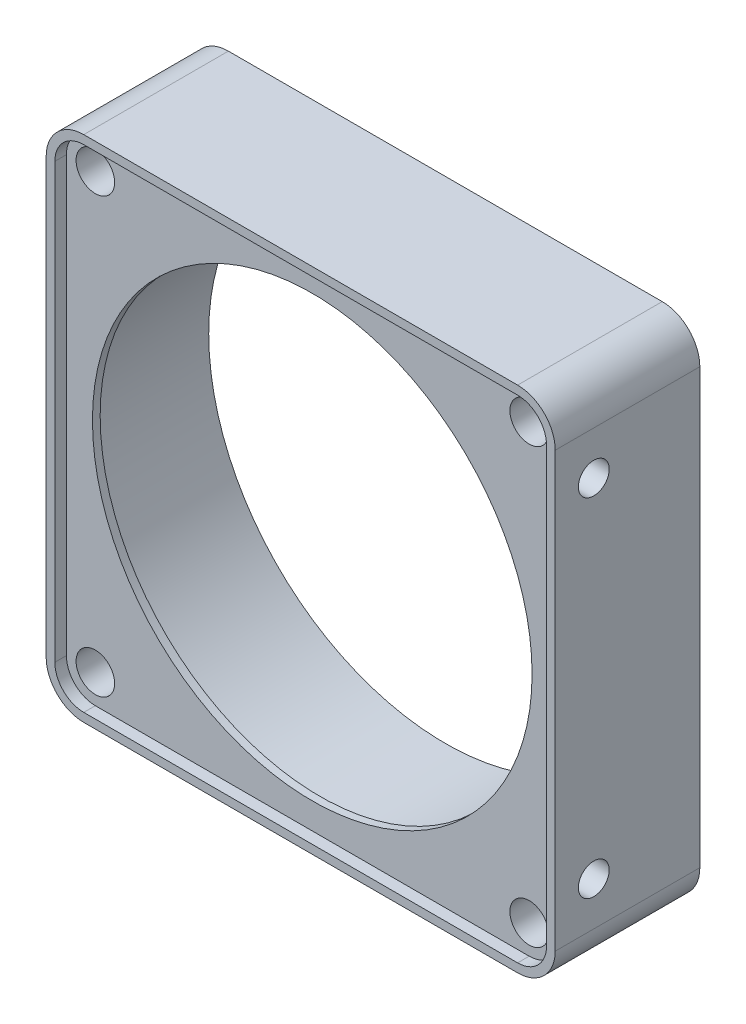
ISO-10303-21;
HEADER;
FILE_DESCRIPTION(('STEP AP214'),'2;1');
FILE_NAME('part.step','',(''),(''),'','','');
FILE_SCHEMA(('AUTOMOTIVE_DESIGN { 1 0 10303 214 1 1 1 1 }'));
ENDSEC;
DATA;
#1=APPLICATION_CONTEXT('core data for automotive mechanical design processes');
#2=APPLICATION_PROTOCOL_DEFINITION('international standard','automotive_design',2000,#1);
#3=PRODUCT_CONTEXT('',#1,'mechanical');
#4=PRODUCT('Part','Part','',(#3));
#5=PRODUCT_RELATED_PRODUCT_CATEGORY('part','',(#4));
#6=PRODUCT_DEFINITION_FORMATION('','',#4);
#7=PRODUCT_DEFINITION_CONTEXT('part definition',#1,'design');
#8=PRODUCT_DEFINITION('design','',#6,#7);
#9=PRODUCT_DEFINITION_SHAPE('','',#8);
#10=(LENGTH_UNIT() NAMED_UNIT(*) SI_UNIT(.MILLI.,.METRE.));
#11=(NAMED_UNIT(*) PLANE_ANGLE_UNIT() SI_UNIT($,.RADIAN.));
#12=(NAMED_UNIT(*) SI_UNIT($,.STERADIAN.) SOLID_ANGLE_UNIT());
#13=UNCERTAINTY_MEASURE_WITH_UNIT(LENGTH_MEASURE(1.E-05),#10,'distance_accuracy_value','');
#14=(GEOMETRIC_REPRESENTATION_CONTEXT(3) GLOBAL_UNCERTAINTY_ASSIGNED_CONTEXT((#13)) GLOBAL_UNIT_ASSIGNED_CONTEXT((#10,
#11,#12)) REPRESENTATION_CONTEXT('',''));
#15=CARTESIAN_POINT('',(0.,0.,0.));
#16=DIRECTION('',(0.,0.,1.));
#17=DIRECTION('',(1.,0.,0.));
#18=AXIS2_PLACEMENT_3D('',#15,#16,#17);
#19=CARTESIAN_POINT('',(-11.25,11.25,-66.75));
#20=DIRECTION('',(0.,0.,1.));
#21=DIRECTION('',(1.,0.,0.));
#22=AXIS2_PLACEMENT_3D('',#19,#20,#21);
#23=CYLINDRICAL_SURFACE('',#22,1.);
#24=CARTESIAN_POINT('',(-11.25,11.25,6.89999999999999));
#25=DIRECTION('',(0.,0.,1.));
#26=DIRECTION('',(1.,0.,0.));
#27=AXIS2_PLACEMENT_3D('',#24,#25,#26);
#28=CIRCLE('',#27,1.);
#29=CARTESIAN_POINT('',(-10.25,11.25,6.89999999999999));
#30=VERTEX_POINT('',#29);
#31=EDGE_CURVE('E19',#30,#30,#28,.F.);
#32=ORIENTED_EDGE('',*,*,#31,.F.);
#33=EDGE_LOOP('',(#32));
#34=FACE_BOUND('',#33,.T.);
#35=CARTESIAN_POINT('',(-11.25,11.25,0.600000000000003));
#36=DIRECTION('',(0.,0.,1.));
#37=DIRECTION('',(1.,0.,0.));
#38=AXIS2_PLACEMENT_3D('',#35,#36,#37);
#39=CIRCLE('',#38,1.);
#40=CARTESIAN_POINT('',(-10.25,11.25,0.600000000000003));
#41=VERTEX_POINT('',#40);
#42=EDGE_CURVE('E292',#41,#41,#39,.T.);
#43=ORIENTED_EDGE('',*,*,#42,.F.);
#44=EDGE_LOOP('',(#43));
#45=FACE_BOUND('',#44,.T.);
#46=ADVANCED_FACE('F16',(#34,#45),#23,.F.);
#47=CARTESIAN_POINT('',(11.25,11.25,-66.75));
#48=DIRECTION('',(0.,0.,1.));
#49=DIRECTION('',(1.,0.,0.));
#50=AXIS2_PLACEMENT_3D('',#47,#48,#49);
#51=CYLINDRICAL_SURFACE('',#50,1.);
#52=CARTESIAN_POINT('',(11.25,11.25,6.89999999999999));
#53=DIRECTION('',(0.,0.,1.));
#54=DIRECTION('',(1.,0.,0.));
#55=AXIS2_PLACEMENT_3D('',#52,#53,#54);
#56=CIRCLE('',#55,1.);
#57=CARTESIAN_POINT('',(12.25,11.25,6.89999999999999));
#58=VERTEX_POINT('',#57);
#59=EDGE_CURVE('E163',#58,#58,#56,.F.);
#60=ORIENTED_EDGE('',*,*,#59,.F.);
#61=EDGE_LOOP('',(#60));
#62=FACE_BOUND('',#61,.T.);
#63=CARTESIAN_POINT('',(11.25,11.25,0.600000000000003));
#64=DIRECTION('',(0.,0.,1.));
#65=DIRECTION('',(1.,0.,0.));
#66=AXIS2_PLACEMENT_3D('',#63,#64,#65);
#67=CIRCLE('',#66,1.);
#68=CARTESIAN_POINT('',(12.25,11.25,0.600000000000003));
#69=VERTEX_POINT('',#68);
#70=EDGE_CURVE('E289',#69,#69,#67,.F.);
#71=ORIENTED_EDGE('',*,*,#70,.T.);
#72=EDGE_LOOP('',(#71));
#73=FACE_BOUND('',#72,.T.);
#74=ADVANCED_FACE('F316',(#62,#73),#51,.F.);
#75=CARTESIAN_POINT('',(-10.2,-9.,5.5));
#76=DIRECTION('',(-1.,0.,0.));
#77=DIRECTION('',(0.,-1.,0.));
#78=AXIS2_PLACEMENT_3D('',#75,#76,#77);
#79=PLANE('',#78);
#80=CARTESIAN_POINT('',(-10.2,-9.,5.5));
#81=DIRECTION('',(-1.,0.,0.));
#82=DIRECTION('',(0.,-1.,0.));
#83=AXIS2_PLACEMENT_3D('',#80,#81,#82);
#84=CIRCLE('',#83,0.8);
#85=CARTESIAN_POINT('',(-10.2,-9.8,5.5));
#86=VERTEX_POINT('',#85);
#87=EDGE_CURVE('E286',#86,#86,#84,.T.);
#88=ORIENTED_EDGE('',*,*,#87,.T.);
#89=EDGE_LOOP('',(#88));
#90=FACE_BOUND('',#89,.T.);
#91=ADVANCED_FACE('F481',(#90),#79,.T.);
#92=CARTESIAN_POINT('',(-10.2,9.,5.5));
#93=DIRECTION('',(-1.,0.,0.));
#94=DIRECTION('',(0.,-1.,0.));
#95=AXIS2_PLACEMENT_3D('',#92,#93,#94);
#96=PLANE('',#95);
#97=CARTESIAN_POINT('',(-10.2,9.,5.5));
#98=DIRECTION('',(-1.,0.,0.));
#99=DIRECTION('',(0.,-1.,0.));
#100=AXIS2_PLACEMENT_3D('',#97,#98,#99);
#101=CIRCLE('',#100,0.8);
#102=CARTESIAN_POINT('',(-10.2,8.2,5.5));
#103=VERTEX_POINT('',#102);
#104=EDGE_CURVE('E283',#103,#103,#101,.T.);
#105=ORIENTED_EDGE('',*,*,#104,.T.);
#106=EDGE_LOOP('',(#105));
#107=FACE_BOUND('',#106,.T.);
#108=ADVANCED_FACE('F477',(#107),#96,.T.);
#109=CARTESIAN_POINT('',(10.2,9.,5.5));
#110=DIRECTION('',(1.,0.,0.));
#111=DIRECTION('',(0.,0.,-1.));
#112=AXIS2_PLACEMENT_3D('',#109,#110,#111);
#113=PLANE('',#112);
#114=CARTESIAN_POINT('',(10.2,9.,5.5));
#115=DIRECTION('',(1.,0.,0.));
#116=DIRECTION('',(0.,0.,-1.));
#117=AXIS2_PLACEMENT_3D('',#114,#115,#116);
#118=CIRCLE('',#117,0.8);
#119=CARTESIAN_POINT('',(10.2,9.,4.7));
#120=VERTEX_POINT('',#119);
#121=EDGE_CURVE('E280',#120,#120,#118,.T.);
#122=ORIENTED_EDGE('',*,*,#121,.T.);
#123=EDGE_LOOP('',(#122));
#124=FACE_BOUND('',#123,.T.);
#125=ADVANCED_FACE('F474',(#124),#113,.T.);
#126=CARTESIAN_POINT('',(-11.25,-12.75,6.89999999999999));
#127=DIRECTION('',(0.,-1.,0.));
#128=DIRECTION('',(1.,0.,0.));
#129=AXIS2_PLACEMENT_3D('',#126,#127,#128);
#130=PLANE('',#129);
#131=DIRECTION('',(0.,0.,1.));
#132=VECTOR('',#131,1.);
#133=CARTESIAN_POINT('',(11.25,-12.75,6.89999999999999));
#134=LINE('',#133,#132);
#135=CARTESIAN_POINT('',(11.25,-12.75,7.49999999999999));
#136=VERTEX_POINT('',#135);
#137=CARTESIAN_POINT('',(11.25,-12.75,6.89999999999999));
#138=VERTEX_POINT('',#137);
#139=EDGE_CURVE('E143',#136,#138,#134,.F.);
#140=ORIENTED_EDGE('',*,*,#139,.T.);
#141=DIRECTION('',(1.,0.,0.));
#142=VECTOR('',#141,1.);
#143=CARTESIAN_POINT('',(11.25,-12.75,6.89999999999999));
#144=LINE('',#143,#142);
#145=CARTESIAN_POINT('',(-11.25,-12.75,6.89999999999999));
#146=VERTEX_POINT('',#145);
#147=EDGE_CURVE('E128',#146,#138,#144,.T.);
#148=ORIENTED_EDGE('',*,*,#147,.F.);
#149=DIRECTION('',(0.,0.,1.));
#150=VECTOR('',#149,1.);
#151=CARTESIAN_POINT('',(-11.25,-12.75,6.89999999999999));
#152=LINE('',#151,#150);
#153=CARTESIAN_POINT('',(-11.25,-12.75,7.49999999999999));
#154=VERTEX_POINT('',#153);
#155=EDGE_CURVE('E179',#146,#154,#152,.T.);
#156=ORIENTED_EDGE('',*,*,#155,.T.);
#157=DIRECTION('',(1.,0.,0.));
#158=VECTOR('',#157,1.);
#159=CARTESIAN_POINT('',(-13.2,-12.75,7.5));
#160=LINE('',#159,#158);
#161=EDGE_CURVE('E279',#136,#154,#160,.F.);
#162=ORIENTED_EDGE('',*,*,#161,.F.);
#163=EDGE_LOOP('',(#140,#148,#156,#162));
#164=FACE_BOUND('',#163,.T.);
#165=ADVANCED_FACE('F448',(#164),#130,.F.);
#166=CARTESIAN_POINT('',(-11.25,-11.25,6.89999999999999));
#167=DIRECTION('',(0.,0.,1.));
#168=DIRECTION('',(1.,0.,0.));
#169=AXIS2_PLACEMENT_3D('',#166,#167,#168);
#170=CYLINDRICAL_SURFACE('',#169,1.5);
#171=ORIENTED_EDGE('',*,*,#155,.F.);
#172=CARTESIAN_POINT('',(-11.25,-11.25,6.89999999999999));
#173=DIRECTION('',(0.,0.,1.));
#174=DIRECTION('',(1.,0.,0.));
#175=AXIS2_PLACEMENT_3D('',#172,#173,#174);
#176=CIRCLE('',#175,1.5);
#177=CARTESIAN_POINT('',(-12.75,-11.25,6.89999999999999));
#178=VERTEX_POINT('',#177);
#179=EDGE_CURVE('E298',#178,#146,#176,.T.);
#180=ORIENTED_EDGE('',*,*,#179,.F.);
#181=DIRECTION('',(0.,0.,1.));
#182=VECTOR('',#181,1.);
#183=CARTESIAN_POINT('',(-12.75,-11.25,6.89999999999999));
#184=LINE('',#183,#182);
#185=CARTESIAN_POINT('',(-12.75,-11.25,7.49999999999999));
#186=VERTEX_POINT('',#185);
#187=EDGE_CURVE('E176',#178,#186,#184,.T.);
#188=ORIENTED_EDGE('',*,*,#187,.T.);
#189=CARTESIAN_POINT('',(-11.25,-11.25,7.49999999999999));
#190=DIRECTION('',(0.,0.,1.));
#191=DIRECTION('',(1.,0.,0.));
#192=AXIS2_PLACEMENT_3D('',#189,#190,#191);
#193=CIRCLE('',#192,1.5);
#194=EDGE_CURVE('E277',#154,#186,#193,.F.);
#195=ORIENTED_EDGE('',*,*,#194,.F.);
#196=EDGE_LOOP('',(#171,#180,#188,#195));
#197=FACE_BOUND('',#196,.T.);
#198=ADVANCED_FACE('F443',(#197),#170,.F.);
#199=CARTESIAN_POINT('',(-12.75,11.25,6.89999999999999));
#200=DIRECTION('',(-1.,0.,0.));
#201=DIRECTION('',(0.,-1.,0.));
#202=AXIS2_PLACEMENT_3D('',#199,#200,#201);
#203=PLANE('',#202);
#204=ORIENTED_EDGE('',*,*,#187,.F.);
#205=DIRECTION('',(0.,1.,0.));
#206=VECTOR('',#205,1.);
#207=CARTESIAN_POINT('',(-12.75,-11.25,6.89999999999999));
#208=LINE('',#207,#206);
#209=CARTESIAN_POINT('',(-12.75,11.25,6.89999999999999));
#210=VERTEX_POINT('',#209);
#211=EDGE_CURVE('E300',#210,#178,#208,.F.);
#212=ORIENTED_EDGE('',*,*,#211,.F.);
#213=DIRECTION('',(0.,0.,1.));
#214=VECTOR('',#213,1.);
#215=CARTESIAN_POINT('',(-12.75,11.25,6.89999999999999));
#216=LINE('',#215,#214);
#217=CARTESIAN_POINT('',(-12.75,11.25,7.49999999999999));
#218=VERTEX_POINT('',#217);
#219=EDGE_CURVE('E173',#210,#218,#216,.T.);
#220=ORIENTED_EDGE('',*,*,#219,.T.);
#221=DIRECTION('',(0.,1.,0.));
#222=VECTOR('',#221,1.);
#223=CARTESIAN_POINT('',(-12.75,-13.2,7.5));
#224=LINE('',#223,#222);
#225=EDGE_CURVE('E276',#186,#218,#224,.T.);
#226=ORIENTED_EDGE('',*,*,#225,.F.);
#227=EDGE_LOOP('',(#204,#212,#220,#226));
#228=FACE_BOUND('',#227,.T.);
#229=ADVANCED_FACE('F461',(#228),#203,.F.);
#230=CARTESIAN_POINT('',(-11.25,11.25,6.89999999999999));
#231=DIRECTION('',(0.,0.,1.));
#232=DIRECTION('',(1.,0.,0.));
#233=AXIS2_PLACEMENT_3D('',#230,#231,#232);
#234=CYLINDRICAL_SURFACE('',#233,1.5);
#235=ORIENTED_EDGE('',*,*,#219,.F.);
#236=CARTESIAN_POINT('',(-11.25,11.25,6.89999999999999));
#237=DIRECTION('',(0.,0.,1.));
#238=DIRECTION('',(1.,0.,0.));
#239=AXIS2_PLACEMENT_3D('',#236,#237,#238);
#240=CIRCLE('',#239,1.5);
#241=CARTESIAN_POINT('',(-11.25,12.75,6.89999999999999));
#242=VERTEX_POINT('',#241);
#243=EDGE_CURVE('E301',#242,#210,#240,.T.);
#244=ORIENTED_EDGE('',*,*,#243,.F.);
#245=DIRECTION('',(0.,0.,1.));
#246=VECTOR('',#245,1.);
#247=CARTESIAN_POINT('',(-11.25,12.75,6.89999999999999));
#248=LINE('',#247,#246);
#249=CARTESIAN_POINT('',(-11.25,12.75,7.49999999999999));
#250=VERTEX_POINT('',#249);
#251=EDGE_CURVE('E170',#242,#250,#248,.T.);
#252=ORIENTED_EDGE('',*,*,#251,.T.);
#253=CARTESIAN_POINT('',(-11.25,11.25,7.49999999999999));
#254=DIRECTION('',(0.,0.,1.));
#255=DIRECTION('',(1.,0.,0.));
#256=AXIS2_PLACEMENT_3D('',#253,#254,#255);
#257=CIRCLE('',#256,1.5);
#258=EDGE_CURVE('E274',#218,#250,#257,.F.);
#259=ORIENTED_EDGE('',*,*,#258,.F.);
#260=EDGE_LOOP('',(#235,#244,#252,#259));
#261=FACE_BOUND('',#260,.T.);
#262=ADVANCED_FACE('F460',(#261),#234,.F.);
#263=CARTESIAN_POINT('',(11.25,12.75,6.89999999999999));
#264=DIRECTION('',(0.,1.,0.));
#265=DIRECTION('',(-1.,0.,0.));
#266=AXIS2_PLACEMENT_3D('',#263,#264,#265);
#267=PLANE('',#266);
#268=ORIENTED_EDGE('',*,*,#251,.F.);
#269=DIRECTION('',(1.,0.,0.));
#270=VECTOR('',#269,1.);
#271=CARTESIAN_POINT('',(11.25,12.75,6.89999999999999));
#272=LINE('',#271,#270);
#273=CARTESIAN_POINT('',(11.25,12.75,6.89999999999999));
#274=VERTEX_POINT('',#273);
#275=EDGE_CURVE('E158',#274,#242,#272,.F.);
#276=ORIENTED_EDGE('',*,*,#275,.F.);
#277=DIRECTION('',(0.,0.,1.));
#278=VECTOR('',#277,1.);
#279=CARTESIAN_POINT('',(11.25,12.75,6.89999999999999));
#280=LINE('',#279,#278);
#281=CARTESIAN_POINT('',(11.25,12.75,7.49999999999999));
#282=VERTEX_POINT('',#281);
#283=EDGE_CURVE('E167',#274,#282,#280,.T.);
#284=ORIENTED_EDGE('',*,*,#283,.T.);
#285=DIRECTION('',(1.,0.,0.));
#286=VECTOR('',#285,1.);
#287=CARTESIAN_POINT('',(-13.2,12.75,7.5));
#288=LINE('',#287,#286);
#289=EDGE_CURVE('E273',#250,#282,#288,.T.);
#290=ORIENTED_EDGE('',*,*,#289,.F.);
#291=EDGE_LOOP('',(#268,#276,#284,#290));
#292=FACE_BOUND('',#291,.T.);
#293=ADVANCED_FACE('F457',(#292),#267,.F.);
#294=CARTESIAN_POINT('',(11.25,11.25,6.89999999999999));
#295=DIRECTION('',(0.,0.,1.));
#296=DIRECTION('',(1.,0.,0.));
#297=AXIS2_PLACEMENT_3D('',#294,#295,#296);
#298=CYLINDRICAL_SURFACE('',#297,1.5);
#299=ORIENTED_EDGE('',*,*,#283,.F.);
#300=CARTESIAN_POINT('',(11.25,11.25,6.89999999999999));
#301=DIRECTION('',(0.,0.,1.));
#302=DIRECTION('',(1.,0.,0.));
#303=AXIS2_PLACEMENT_3D('',#300,#301,#302);
#304=CIRCLE('',#303,1.5);
#305=CARTESIAN_POINT('',(12.75,11.25,6.89999999999999));
#306=VERTEX_POINT('',#305);
#307=EDGE_CURVE('E156',#306,#274,#304,.T.);
#308=ORIENTED_EDGE('',*,*,#307,.F.);
#309=DIRECTION('',(0.,0.,-1.));
#310=VECTOR('',#309,1.);
#311=CARTESIAN_POINT('',(12.75,11.25,6.89999999999999));
#312=LINE('',#311,#310);
#313=CARTESIAN_POINT('',(12.75,11.25,7.49999999999999));
#314=VERTEX_POINT('',#313);
#315=EDGE_CURVE('E155',#306,#314,#312,.F.);
#316=ORIENTED_EDGE('',*,*,#315,.T.);
#317=CARTESIAN_POINT('',(11.25,11.25,7.49999999999999));
#318=DIRECTION('',(0.,0.,1.));
#319=DIRECTION('',(1.,0.,0.));
#320=AXIS2_PLACEMENT_3D('',#317,#318,#319);
#321=CIRCLE('',#320,1.5);
#322=EDGE_CURVE('E271',#282,#314,#321,.F.);
#323=ORIENTED_EDGE('',*,*,#322,.F.);
#324=EDGE_LOOP('',(#299,#308,#316,#323));
#325=FACE_BOUND('',#324,.T.);
#326=ADVANCED_FACE('F454',(#325),#298,.F.);
#327=CARTESIAN_POINT('',(12.75,-11.25,6.89999999999999));
#328=DIRECTION('',(1.,0.,0.));
#329=DIRECTION('',(0.,0.,-1.));
#330=AXIS2_PLACEMENT_3D('',#327,#328,#329);
#331=PLANE('',#330);
#332=ORIENTED_EDGE('',*,*,#315,.F.);
#333=DIRECTION('',(0.,1.,0.));
#334=VECTOR('',#333,1.);
#335=CARTESIAN_POINT('',(12.75,-11.25,6.89999999999999));
#336=LINE('',#335,#334);
#337=CARTESIAN_POINT('',(12.75,-11.25,6.89999999999999));
#338=VERTEX_POINT('',#337);
#339=EDGE_CURVE('E150',#338,#306,#336,.T.);
#340=ORIENTED_EDGE('',*,*,#339,.F.);
#341=DIRECTION('',(0.,0.,1.));
#342=VECTOR('',#341,1.);
#343=CARTESIAN_POINT('',(12.75,-11.25,6.89999999999999));
#344=LINE('',#343,#342);
#345=CARTESIAN_POINT('',(12.75,-11.25,7.49999999999999));
#346=VERTEX_POINT('',#345);
#347=EDGE_CURVE('E135',#338,#346,#344,.T.);
#348=ORIENTED_EDGE('',*,*,#347,.T.);
#349=DIRECTION('',(0.,1.,0.));
#350=VECTOR('',#349,1.);
#351=CARTESIAN_POINT('',(12.75,-13.2,7.5));
#352=LINE('',#351,#350);
#353=EDGE_CURVE('E270',#314,#346,#352,.F.);
#354=ORIENTED_EDGE('',*,*,#353,.F.);
#355=EDGE_LOOP('',(#332,#340,#348,#354));
#356=FACE_BOUND('',#355,.T.);
#357=ADVANCED_FACE('F153',(#356),#331,.F.);
#358=CARTESIAN_POINT('',(11.25,-11.25,6.89999999999999));
#359=DIRECTION('',(0.,0.,1.));
#360=DIRECTION('',(1.,0.,0.));
#361=AXIS2_PLACEMENT_3D('',#358,#359,#360);
#362=CYLINDRICAL_SURFACE('',#361,1.5);
#363=ORIENTED_EDGE('',*,*,#347,.F.);
#364=CARTESIAN_POINT('',(11.25,-11.25,6.89999999999999));
#365=DIRECTION('',(0.,0.,1.));
#366=DIRECTION('',(1.,0.,0.));
#367=AXIS2_PLACEMENT_3D('',#364,#365,#366);
#368=CIRCLE('',#367,1.5);
#369=EDGE_CURVE('E137',#138,#338,#368,.T.);
#370=ORIENTED_EDGE('',*,*,#369,.F.);
#371=ORIENTED_EDGE('',*,*,#139,.F.);
#372=CARTESIAN_POINT('',(11.25,-11.25,7.49999999999999));
#373=DIRECTION('',(0.,0.,1.));
#374=DIRECTION('',(1.,0.,0.));
#375=AXIS2_PLACEMENT_3D('',#372,#373,#374);
#376=CIRCLE('',#375,1.5);
#377=EDGE_CURVE('E139',#346,#136,#376,.F.);
#378=ORIENTED_EDGE('',*,*,#377,.F.);
#379=EDGE_LOOP('',(#363,#370,#371,#378));
#380=FACE_BOUND('',#379,.T.);
#381=ADVANCED_FACE('F136',(#380),#362,.F.);
#382=CARTESIAN_POINT('',(10.2,-9.00000000000001,5.5));
#383=DIRECTION('',(1.,0.,0.));
#384=DIRECTION('',(0.,0.,-1.));
#385=AXIS2_PLACEMENT_3D('',#382,#383,#384);
#386=PLANE('',#385);
#387=CARTESIAN_POINT('',(10.2,-9.00000000000001,5.5));
#388=DIRECTION('',(1.,0.,0.));
#389=DIRECTION('',(0.,0.,-1.));
#390=AXIS2_PLACEMENT_3D('',#387,#388,#389);
#391=CIRCLE('',#390,0.8);
#392=CARTESIAN_POINT('',(10.2,-9.00000000000001,4.7));
#393=VERTEX_POINT('',#392);
#394=EDGE_CURVE('E266',#393,#393,#391,.T.);
#395=ORIENTED_EDGE('',*,*,#394,.T.);
#396=EDGE_LOOP('',(#395));
#397=FACE_BOUND('',#396,.T.);
#398=ADVANCED_FACE('F515',(#397),#386,.T.);
#399=CARTESIAN_POINT('',(-11.25,-11.25,-66.75));
#400=DIRECTION('',(0.,0.,1.));
#401=DIRECTION('',(1.,0.,0.));
#402=AXIS2_PLACEMENT_3D('',#399,#400,#401);
#403=CYLINDRICAL_SURFACE('',#402,1.);
#404=CARTESIAN_POINT('',(-11.25,-11.25,6.89999999999999));
#405=DIRECTION('',(0.,0.,1.));
#406=DIRECTION('',(1.,0.,0.));
#407=AXIS2_PLACEMENT_3D('',#404,#405,#406);
#408=CIRCLE('',#407,1.);
#409=CARTESIAN_POINT('',(-10.25,-11.25,6.89999999999999));
#410=VERTEX_POINT('',#409);
#411=EDGE_CURVE('E305',#410,#410,#408,.F.);
#412=ORIENTED_EDGE('',*,*,#411,.F.);
#413=EDGE_LOOP('',(#412));
#414=FACE_BOUND('',#413,.T.);
#415=CARTESIAN_POINT('',(-11.25,-11.25,0.600000000000003));
#416=DIRECTION('',(0.,0.,1.));
#417=DIRECTION('',(1.,0.,0.));
#418=AXIS2_PLACEMENT_3D('',#415,#416,#417);
#419=CIRCLE('',#418,1.);
#420=CARTESIAN_POINT('',(-10.25,-11.25,0.600000000000003));
#421=VERTEX_POINT('',#420);
#422=EDGE_CURVE('E263',#421,#421,#419,.F.);
#423=ORIENTED_EDGE('',*,*,#422,.T.);
#424=EDGE_LOOP('',(#423));
#425=FACE_BOUND('',#424,.T.);
#426=ADVANCED_FACE('F511',(#414,#425),#403,.F.);
#427=CARTESIAN_POINT('',(11.25,-11.25,-66.75));
#428=DIRECTION('',(0.,0.,1.));
#429=DIRECTION('',(1.,0.,0.));
#430=AXIS2_PLACEMENT_3D('',#427,#428,#429);
#431=CYLINDRICAL_SURFACE('',#430,1.);
#432=CARTESIAN_POINT('',(11.25,-11.25,6.89999999999999));
#433=DIRECTION('',(0.,0.,1.));
#434=DIRECTION('',(1.,0.,0.));
#435=AXIS2_PLACEMENT_3D('',#432,#433,#434);
#436=CIRCLE('',#435,1.);
#437=CARTESIAN_POINT('',(12.25,-11.25,6.89999999999999));
#438=VERTEX_POINT('',#437);
#439=EDGE_CURVE('E295',#438,#438,#436,.F.);
#440=ORIENTED_EDGE('',*,*,#439,.F.);
#441=EDGE_LOOP('',(#440));
#442=FACE_BOUND('',#441,.T.);
#443=CARTESIAN_POINT('',(11.25,-11.25,0.600000000000003));
#444=DIRECTION('',(0.,0.,1.));
#445=DIRECTION('',(1.,0.,0.));
#446=AXIS2_PLACEMENT_3D('',#443,#444,#445);
#447=CIRCLE('',#446,1.);
#448=CARTESIAN_POINT('',(12.25,-11.25,0.600000000000003));
#449=VERTEX_POINT('',#448);
#450=EDGE_CURVE('E260',#449,#449,#447,.T.);
#451=ORIENTED_EDGE('',*,*,#450,.F.);
#452=EDGE_LOOP('',(#451));
#453=FACE_BOUND('',#452,.T.);
#454=ADVANCED_FACE('F507',(#442,#453),#431,.F.);
#455=CARTESIAN_POINT('',(11.25,-11.25,6.89999999999999));
#456=DIRECTION('',(0.,0.,1.));
#457=DIRECTION('',(1.,0.,0.));
#458=AXIS2_PLACEMENT_3D('',#455,#456,#457);
#459=PLANE('',#458);
#460=ORIENTED_EDGE('',*,*,#439,.T.);
#461=EDGE_LOOP('',(#460));
#462=FACE_BOUND('',#461,.T.);
#463=ORIENTED_EDGE('',*,*,#211,.T.);
#464=ORIENTED_EDGE('',*,*,#179,.T.);
#465=ORIENTED_EDGE('',*,*,#147,.T.);
#466=ORIENTED_EDGE('',*,*,#369,.T.);
#467=ORIENTED_EDGE('',*,*,#339,.T.);
#468=ORIENTED_EDGE('',*,*,#307,.T.);
#469=ORIENTED_EDGE('',*,*,#275,.T.);
#470=ORIENTED_EDGE('',*,*,#243,.T.);
#471=EDGE_LOOP('',(#463,#464,#465,#466,#467,#468,#469,#470));
#472=FACE_BOUND('',#471,.T.);
#473=ORIENTED_EDGE('',*,*,#59,.T.);
#474=EDGE_LOOP('',(#473));
#475=FACE_BOUND('',#474,.T.);
#476=ORIENTED_EDGE('',*,*,#411,.T.);
#477=EDGE_LOOP('',(#476));
#478=FACE_BOUND('',#477,.T.);
#479=ORIENTED_EDGE('',*,*,#31,.T.);
#480=EDGE_LOOP('',(#479));
#481=FACE_BOUND('',#480,.T.);
#482=CARTESIAN_POINT('',(0.,0.,6.89999999999999));
#483=DIRECTION('',(0.,0.,-1.));
#484=DIRECTION('',(-1.,0.,0.));
#485=AXIS2_PLACEMENT_3D('',#482,#483,#484);
#486=CIRCLE('',#485,11.4);
#487=CARTESIAN_POINT('',(-11.4,0.,6.89999999999999));
#488=VERTEX_POINT('',#487);
#489=EDGE_CURVE('E257',#488,#488,#486,.T.);
#490=ORIENTED_EDGE('',*,*,#489,.T.);
#491=EDGE_LOOP('',(#490));
#492=FACE_BOUND('',#491,.T.);
#493=ADVANCED_FACE('F147',(#462,#472,#475,#478,#481,#492),#459,.T.);
#494=CARTESIAN_POINT('',(-11.25,11.25,0.6));
#495=DIRECTION('',(0.,0.,-1.));
#496=DIRECTION('',(-1.,0.,0.));
#497=AXIS2_PLACEMENT_3D('',#494,#495,#496);
#498=PLANE('',#497);
#499=ORIENTED_EDGE('',*,*,#42,.T.);
#500=EDGE_LOOP('',(#499));
#501=FACE_BOUND('',#500,.T.);
#502=CARTESIAN_POINT('',(-11.25,11.25,0.6));
#503=DIRECTION('',(0.,0.,-1.));
#504=DIRECTION('',(-1.,0.,0.));
#505=AXIS2_PLACEMENT_3D('',#502,#503,#504);
#506=CIRCLE('',#505,1.6);
#507=CARTESIAN_POINT('',(-12.85,11.25,0.6));
#508=VERTEX_POINT('',#507);
#509=EDGE_CURVE('E254',#508,#508,#506,.T.);
#510=ORIENTED_EDGE('',*,*,#509,.T.);
#511=EDGE_LOOP('',(#510));
#512=FACE_BOUND('',#511,.T.);
#513=ADVANCED_FACE('F319',(#501,#512),#498,.T.);
#514=CARTESIAN_POINT('',(11.25,11.25,0.6));
#515=DIRECTION('',(0.,0.,1.));
#516=DIRECTION('',(1.,0.,0.));
#517=AXIS2_PLACEMENT_3D('',#514,#515,#516);
#518=PLANE('',#517);
#519=CARTESIAN_POINT('',(11.25,11.25,0.6));
#520=DIRECTION('',(0.,0.,-1.));
#521=DIRECTION('',(-1.,0.,0.));
#522=AXIS2_PLACEMENT_3D('',#519,#520,#521);
#523=CIRCLE('',#522,1.6);
#524=CARTESIAN_POINT('',(9.65,11.25,0.6));
#525=VERTEX_POINT('',#524);
#526=EDGE_CURVE('E251',#525,#525,#523,.T.);
#527=ORIENTED_EDGE('',*,*,#526,.T.);
#528=EDGE_LOOP('',(#527));
#529=FACE_BOUND('',#528,.T.);
#530=ORIENTED_EDGE('',*,*,#70,.F.);
#531=EDGE_LOOP('',(#530));
#532=FACE_BOUND('',#531,.T.);
#533=ADVANCED_FACE('F322',(#529,#532),#518,.F.);
#534=CARTESIAN_POINT('',(-10.2,-9.,5.5));
#535=DIRECTION('',(-1.,0.,0.));
#536=DIRECTION('',(0.,-1.,0.));
#537=AXIS2_PLACEMENT_3D('',#534,#535,#536);
#538=CYLINDRICAL_SURFACE('',#537,0.8);
#539=CARTESIAN_POINT('',(-13.2,-9.,5.5));
#540=DIRECTION('',(-1.,0.,0.));
#541=DIRECTION('',(0.,-1.,0.));
#542=AXIS2_PLACEMENT_3D('',#539,#540,#541);
#543=CIRCLE('',#542,0.8);
#544=CARTESIAN_POINT('',(-13.2,-9.8,5.5));
#545=VERTEX_POINT('',#544);
#546=EDGE_CURVE('E240',#545,#545,#543,.T.);
#547=ORIENTED_EDGE('',*,*,#546,.T.);
#548=EDGE_LOOP('',(#547));
#549=FACE_BOUND('',#548,.T.);
#550=ORIENTED_EDGE('',*,*,#87,.F.);
#551=EDGE_LOOP('',(#550));
#552=FACE_BOUND('',#551,.T.);
#553=ADVANCED_FACE('F494',(#549,#552),#538,.F.);
#554=CARTESIAN_POINT('',(-10.2,9.,5.5));
#555=DIRECTION('',(-1.,0.,0.));
#556=DIRECTION('',(0.,-1.,0.));
#557=AXIS2_PLACEMENT_3D('',#554,#555,#556);
#558=CYLINDRICAL_SURFACE('',#557,0.8);
#559=CARTESIAN_POINT('',(-13.2,9.,5.5));
#560=DIRECTION('',(-1.,0.,0.));
#561=DIRECTION('',(0.,-1.,0.));
#562=AXIS2_PLACEMENT_3D('',#559,#560,#561);
#563=CIRCLE('',#562,0.8);
#564=CARTESIAN_POINT('',(-13.2,8.2,5.5));
#565=VERTEX_POINT('',#564);
#566=EDGE_CURVE('E236',#565,#565,#563,.T.);
#567=ORIENTED_EDGE('',*,*,#566,.T.);
#568=EDGE_LOOP('',(#567));
#569=FACE_BOUND('',#568,.T.);
#570=ORIENTED_EDGE('',*,*,#104,.F.);
#571=EDGE_LOOP('',(#570));
#572=FACE_BOUND('',#571,.T.);
#573=ADVANCED_FACE('F500',(#569,#572),#558,.F.);
#574=CARTESIAN_POINT('',(10.2,9.,5.5));
#575=DIRECTION('',(1.,0.,0.));
#576=DIRECTION('',(0.,0.,-1.));
#577=AXIS2_PLACEMENT_3D('',#574,#575,#576);
#578=CYLINDRICAL_SURFACE('',#577,0.8);
#579=CARTESIAN_POINT('',(13.2,9.,5.5));
#580=DIRECTION('',(1.,0.,0.));
#581=DIRECTION('',(0.,0.,-1.));
#582=AXIS2_PLACEMENT_3D('',#579,#580,#581);
#583=CIRCLE('',#582,0.8);
#584=CARTESIAN_POINT('',(13.2,9.,4.7));
#585=VERTEX_POINT('',#584);
#586=EDGE_CURVE('E225',#585,#585,#583,.T.);
#587=ORIENTED_EDGE('',*,*,#586,.T.);
#588=EDGE_LOOP('',(#587));
#589=FACE_BOUND('',#588,.T.);
#590=ORIENTED_EDGE('',*,*,#121,.F.);
#591=EDGE_LOOP('',(#590));
#592=FACE_BOUND('',#591,.T.);
#593=ADVANCED_FACE('F580',(#589,#592),#578,.F.);
#594=CARTESIAN_POINT('',(-13.2,-13.2,7.5));
#595=DIRECTION('',(0.,0.,1.));
#596=DIRECTION('',(1.,0.,0.));
#597=AXIS2_PLACEMENT_3D('',#594,#595,#596);
#598=PLANE('',#597);
#599=DIRECTION('',(0.,1.,0.));
#600=VECTOR('',#599,1.);
#601=CARTESIAN_POINT('',(-13.2,13.2,7.5));
#602=LINE('',#601,#600);
#603=CARTESIAN_POINT('',(-13.2,11.25,7.5));
#604=VERTEX_POINT('',#603);
#605=CARTESIAN_POINT('',(-13.2,-11.25,7.5));
#606=VERTEX_POINT('',#605);
#607=EDGE_CURVE('E239',#604,#606,#602,.F.);
#608=ORIENTED_EDGE('',*,*,#607,.T.);
#609=CARTESIAN_POINT('',(-11.25,-11.25,7.5));
#610=DIRECTION('',(0.,0.,-1.));
#611=DIRECTION('',(-1.,0.,0.));
#612=AXIS2_PLACEMENT_3D('',#609,#610,#611);
#613=CIRCLE('',#612,1.95);
#614=CARTESIAN_POINT('',(-11.25,-13.2,7.5));
#615=VERTEX_POINT('',#614);
#616=EDGE_CURVE('E233',#615,#606,#613,.T.);
#617=ORIENTED_EDGE('',*,*,#616,.F.);
#618=DIRECTION('',(-1.,0.,0.));
#619=VECTOR('',#618,1.);
#620=CARTESIAN_POINT('',(-13.2,-13.2,7.5));
#621=LINE('',#620,#619);
#622=CARTESIAN_POINT('',(11.25,-13.2,7.5));
#623=VERTEX_POINT('',#622);
#624=EDGE_CURVE('E232',#615,#623,#621,.F.);
#625=ORIENTED_EDGE('',*,*,#624,.T.);
#626=CARTESIAN_POINT('',(11.25,-11.25,7.5));
#627=DIRECTION('',(0.,0.,-1.));
#628=DIRECTION('',(-1.,0.,0.));
#629=AXIS2_PLACEMENT_3D('',#626,#627,#628);
#630=CIRCLE('',#629,1.95);
#631=CARTESIAN_POINT('',(13.2,-11.25,7.5));
#632=VERTEX_POINT('',#631);
#633=EDGE_CURVE('E230',#632,#623,#630,.T.);
#634=ORIENTED_EDGE('',*,*,#633,.F.);
#635=DIRECTION('',(0.,1.,0.));
#636=VECTOR('',#635,1.);
#637=CARTESIAN_POINT('',(13.2,-13.2,7.5));
#638=LINE('',#637,#636);
#639=CARTESIAN_POINT('',(13.2,11.25,7.5));
#640=VERTEX_POINT('',#639);
#641=EDGE_CURVE('E224',#632,#640,#638,.T.);
#642=ORIENTED_EDGE('',*,*,#641,.T.);
#643=CARTESIAN_POINT('',(11.25,11.25,7.5));
#644=DIRECTION('',(0.,0.,-1.));
#645=DIRECTION('',(-1.,0.,0.));
#646=AXIS2_PLACEMENT_3D('',#643,#644,#645);
#647=CIRCLE('',#646,1.95);
#648=CARTESIAN_POINT('',(11.25,13.2,7.5));
#649=VERTEX_POINT('',#648);
#650=EDGE_CURVE('E248',#649,#640,#647,.T.);
#651=ORIENTED_EDGE('',*,*,#650,.F.);
#652=DIRECTION('',(1.,0.,0.));
#653=VECTOR('',#652,1.);
#654=CARTESIAN_POINT('',(13.2,13.2,7.5));
#655=LINE('',#654,#653);
#656=CARTESIAN_POINT('',(-11.25,13.2,7.5));
#657=VERTEX_POINT('',#656);
#658=EDGE_CURVE('E247',#649,#657,#655,.F.);
#659=ORIENTED_EDGE('',*,*,#658,.T.);
#660=CARTESIAN_POINT('',(-11.25,11.25,7.5));
#661=DIRECTION('',(0.,0.,-1.));
#662=DIRECTION('',(-1.,0.,0.));
#663=AXIS2_PLACEMENT_3D('',#660,#661,#662);
#664=CIRCLE('',#663,1.95);
#665=EDGE_CURVE('E245',#604,#657,#664,.T.);
#666=ORIENTED_EDGE('',*,*,#665,.F.);
#667=EDGE_LOOP('',(#608,#617,#625,#634,#642,#651,#659,#666));
#668=FACE_BOUND('',#667,.T.);
#669=ORIENTED_EDGE('',*,*,#353,.T.);
#670=ORIENTED_EDGE('',*,*,#377,.T.);
#671=ORIENTED_EDGE('',*,*,#161,.T.);
#672=ORIENTED_EDGE('',*,*,#194,.T.);
#673=ORIENTED_EDGE('',*,*,#225,.T.);
#674=ORIENTED_EDGE('',*,*,#258,.T.);
#675=ORIENTED_EDGE('',*,*,#289,.T.);
#676=ORIENTED_EDGE('',*,*,#322,.T.);
#677=EDGE_LOOP('',(#669,#670,#671,#672,#673,#674,#675,#676));
#678=FACE_BOUND('',#677,.T.);
#679=ADVANCED_FACE('F450',(#668,#678),#598,.T.);
#680=CARTESIAN_POINT('',(10.2,-9.00000000000001,5.5));
#681=DIRECTION('',(1.,0.,0.));
#682=DIRECTION('',(0.,0.,-1.));
#683=AXIS2_PLACEMENT_3D('',#680,#681,#682);
#684=CYLINDRICAL_SURFACE('',#683,0.8);
#685=CARTESIAN_POINT('',(13.2,-9.00000000000001,5.5));
#686=DIRECTION('',(1.,0.,0.));
#687=DIRECTION('',(0.,0.,-1.));
#688=AXIS2_PLACEMENT_3D('',#685,#686,#687);
#689=CIRCLE('',#688,0.8);
#690=CARTESIAN_POINT('',(13.2,-9.00000000000001,4.7));
#691=VERTEX_POINT('',#690);
#692=EDGE_CURVE('E221',#691,#691,#689,.T.);
#693=ORIENTED_EDGE('',*,*,#692,.T.);
#694=EDGE_LOOP('',(#693));
#695=FACE_BOUND('',#694,.T.);
#696=ORIENTED_EDGE('',*,*,#394,.F.);
#697=EDGE_LOOP('',(#696));
#698=FACE_BOUND('',#697,.T.);
#699=ADVANCED_FACE('F594',(#695,#698),#684,.F.);
#700=CARTESIAN_POINT('',(-11.25,-11.25,0.6));
#701=DIRECTION('',(0.,0.,1.));
#702=DIRECTION('',(1.,0.,0.));
#703=AXIS2_PLACEMENT_3D('',#700,#701,#702);
#704=PLANE('',#703);
#705=CARTESIAN_POINT('',(-11.25,-11.25,0.6));
#706=DIRECTION('',(0.,0.,-1.));
#707=DIRECTION('',(-1.,0.,0.));
#708=AXIS2_PLACEMENT_3D('',#705,#706,#707);
#709=CIRCLE('',#708,1.6);
#710=CARTESIAN_POINT('',(-12.85,-11.25,0.6));
#711=VERTEX_POINT('',#710);
#712=EDGE_CURVE('E218',#711,#711,#709,.T.);
#713=ORIENTED_EDGE('',*,*,#712,.T.);
#714=EDGE_LOOP('',(#713));
#715=FACE_BOUND('',#714,.T.);
#716=ORIENTED_EDGE('',*,*,#422,.F.);
#717=EDGE_LOOP('',(#716));
#718=FACE_BOUND('',#717,.T.);
#719=ADVANCED_FACE('F602',(#715,#718),#704,.F.);
#720=CARTESIAN_POINT('',(11.25,-11.25,0.6));
#721=DIRECTION('',(0.,0.,-1.));
#722=DIRECTION('',(-1.,0.,0.));
#723=AXIS2_PLACEMENT_3D('',#720,#721,#722);
#724=PLANE('',#723);
#725=ORIENTED_EDGE('',*,*,#450,.T.);
#726=EDGE_LOOP('',(#725));
#727=FACE_BOUND('',#726,.T.);
#728=CARTESIAN_POINT('',(11.25,-11.25,0.6));
#729=DIRECTION('',(0.,0.,-1.));
#730=DIRECTION('',(-1.,0.,0.));
#731=AXIS2_PLACEMENT_3D('',#728,#729,#730);
#732=CIRCLE('',#731,1.6);
#733=CARTESIAN_POINT('',(9.65,-11.25,0.6));
#734=VERTEX_POINT('',#733);
#735=EDGE_CURVE('E215',#734,#734,#732,.T.);
#736=ORIENTED_EDGE('',*,*,#735,.T.);
#737=EDGE_LOOP('',(#736));
#738=FACE_BOUND('',#737,.T.);
#739=ADVANCED_FACE('F340',(#727,#738),#724,.T.);
#740=CARTESIAN_POINT('',(0.,0.,10.4599999999999));
#741=DIRECTION('',(0.,0.,-1.));
#742=DIRECTION('',(-1.,0.,0.));
#743=AXIS2_PLACEMENT_3D('',#740,#741,#742);
#744=CYLINDRICAL_SURFACE('',#743,11.4);
#745=ORIENTED_EDGE('',*,*,#489,.F.);
#746=EDGE_LOOP('',(#745));
#747=FACE_BOUND('',#746,.T.);
#748=CARTESIAN_POINT('',(0.,0.,6.5));
#749=DIRECTION('',(0.,0.,-1.));
#750=DIRECTION('',(-1.,0.,0.));
#751=AXIS2_PLACEMENT_3D('',#748,#749,#750);
#752=CIRCLE('',#751,11.4);
#753=CARTESIAN_POINT('',(-11.4,0.,6.5));
#754=VERTEX_POINT('',#753);
#755=EDGE_CURVE('E212',#754,#754,#752,.T.);
#756=ORIENTED_EDGE('',*,*,#755,.T.);
#757=EDGE_LOOP('',(#756));
#758=FACE_BOUND('',#757,.T.);
#759=ADVANCED_FACE('F329',(#747,#758),#744,.F.);
#760=CARTESIAN_POINT('',(-11.25,11.25,0.6));
#761=DIRECTION('',(0.,0.,-1.));
#762=DIRECTION('',(-1.,0.,0.));
#763=AXIS2_PLACEMENT_3D('',#760,#761,#762);
#764=CYLINDRICAL_SURFACE('',#763,1.6);
#765=CARTESIAN_POINT('',(-11.25,11.25,0.));
#766=DIRECTION('',(0.,0.,-1.));
#767=DIRECTION('',(-1.,0.,0.));
#768=AXIS2_PLACEMENT_3D('',#765,#766,#767);
#769=CIRCLE('',#768,1.6);
#770=CARTESIAN_POINT('',(-12.85,11.25,0.));
#771=VERTEX_POINT('',#770);
#772=EDGE_CURVE('E209',#771,#771,#769,.T.);
#773=ORIENTED_EDGE('',*,*,#772,.T.);
#774=EDGE_LOOP('',(#773));
#775=FACE_BOUND('',#774,.T.);
#776=ORIENTED_EDGE('',*,*,#509,.F.);
#777=EDGE_LOOP('',(#776));
#778=FACE_BOUND('',#777,.T.);
#779=ADVANCED_FACE('F326',(#775,#778),#764,.F.);
#780=CARTESIAN_POINT('',(11.25,11.25,0.6));
#781=DIRECTION('',(0.,0.,-1.));
#782=DIRECTION('',(-1.,0.,0.));
#783=AXIS2_PLACEMENT_3D('',#780,#781,#782);
#784=CYLINDRICAL_SURFACE('',#783,1.6);
#785=CARTESIAN_POINT('',(11.25,11.25,0.));
#786=DIRECTION('',(0.,0.,-1.));
#787=DIRECTION('',(-1.,0.,0.));
#788=AXIS2_PLACEMENT_3D('',#785,#786,#787);
#789=CIRCLE('',#788,1.6);
#790=CARTESIAN_POINT('',(9.65,11.25,0.));
#791=VERTEX_POINT('',#790);
#792=EDGE_CURVE('E206',#791,#791,#789,.T.);
#793=ORIENTED_EDGE('',*,*,#792,.T.);
#794=EDGE_LOOP('',(#793));
#795=FACE_BOUND('',#794,.T.);
#796=ORIENTED_EDGE('',*,*,#526,.F.);
#797=EDGE_LOOP('',(#796));
#798=FACE_BOUND('',#797,.T.);
#799=ADVANCED_FACE('F328',(#795,#798),#784,.F.);
#800=CARTESIAN_POINT('',(11.25,11.25,7.5));
#801=DIRECTION('',(0.,0.,-1.));
#802=DIRECTION('',(-1.,0.,0.));
#803=AXIS2_PLACEMENT_3D('',#800,#801,#802);
#804=CYLINDRICAL_SURFACE('',#803,1.95);
#805=CARTESIAN_POINT('',(11.25,11.25,0.));
#806=DIRECTION('',(0.,0.,-1.));
#807=DIRECTION('',(-1.,0.,0.));
#808=AXIS2_PLACEMENT_3D('',#805,#806,#807);
#809=CIRCLE('',#808,1.95);
#810=CARTESIAN_POINT('',(13.2,11.25,0.));
#811=VERTEX_POINT('',#810);
#812=CARTESIAN_POINT('',(11.25,13.2,0.));
#813=VERTEX_POINT('',#812);
#814=EDGE_CURVE('E203',#811,#813,#809,.F.);
#815=ORIENTED_EDGE('',*,*,#814,.T.);
#816=DIRECTION('',(0.,0.,1.));
#817=VECTOR('',#816,1.);
#818=CARTESIAN_POINT('',(11.25,13.2,7.5));
#819=LINE('',#818,#817);
#820=EDGE_CURVE('E250',#813,#649,#819,.T.);
#821=ORIENTED_EDGE('',*,*,#820,.T.);
#822=ORIENTED_EDGE('',*,*,#650,.T.);
#823=DIRECTION('',(0.,0.,1.));
#824=VECTOR('',#823,1.);
#825=CARTESIAN_POINT('',(13.2,11.25,7.5));
#826=LINE('',#825,#824);
#827=EDGE_CURVE('E228',#640,#811,#826,.F.);
#828=ORIENTED_EDGE('',*,*,#827,.T.);
#829=EDGE_LOOP('',(#815,#821,#822,#828));
#830=FACE_BOUND('',#829,.T.);
#831=ADVANCED_FACE('F337',(#830),#804,.T.);
#832=CARTESIAN_POINT('',(13.2,13.2,7.5));
#833=DIRECTION('',(0.,-1.,0.));
#834=DIRECTION('',(1.,0.,0.));
#835=AXIS2_PLACEMENT_3D('',#832,#833,#834);
#836=PLANE('',#835);
#837=ORIENTED_EDGE('',*,*,#820,.F.);
#838=DIRECTION('',(1.,0.,0.));
#839=VECTOR('',#838,1.);
#840=CARTESIAN_POINT('',(-13.2,13.2,0.));
#841=LINE('',#840,#839);
#842=CARTESIAN_POINT('',(-11.25,13.2,0.));
#843=VERTEX_POINT('',#842);
#844=EDGE_CURVE('E202',#813,#843,#841,.F.);
#845=ORIENTED_EDGE('',*,*,#844,.T.);
#846=DIRECTION('',(0.,0.,-1.));
#847=VECTOR('',#846,1.);
#848=CARTESIAN_POINT('',(-11.25,13.2,7.5));
#849=LINE('',#848,#847);
#850=EDGE_CURVE('E244',#657,#843,#849,.T.);
#851=ORIENTED_EDGE('',*,*,#850,.F.);
#852=ORIENTED_EDGE('',*,*,#658,.F.);
#853=EDGE_LOOP('',(#837,#845,#851,#852));
#854=FACE_BOUND('',#853,.T.);
#855=ADVANCED_FACE('F391',(#854),#836,.F.);
#856=CARTESIAN_POINT('',(-11.25,11.25,7.5));
#857=DIRECTION('',(0.,0.,-1.));
#858=DIRECTION('',(-1.,0.,0.));
#859=AXIS2_PLACEMENT_3D('',#856,#857,#858);
#860=CYLINDRICAL_SURFACE('',#859,1.95);
#861=CARTESIAN_POINT('',(-11.25,11.25,0.));
#862=DIRECTION('',(0.,0.,-1.));
#863=DIRECTION('',(-1.,0.,0.));
#864=AXIS2_PLACEMENT_3D('',#861,#862,#863);
#865=CIRCLE('',#864,1.95);
#866=CARTESIAN_POINT('',(-13.2,11.25,0.));
#867=VERTEX_POINT('',#866);
#868=EDGE_CURVE('E199',#843,#867,#865,.F.);
#869=ORIENTED_EDGE('',*,*,#868,.T.);
#870=DIRECTION('',(0.,0.,1.));
#871=VECTOR('',#870,1.);
#872=CARTESIAN_POINT('',(-13.2,11.25,7.5));
#873=LINE('',#872,#871);
#874=EDGE_CURVE('E243',#867,#604,#873,.T.);
#875=ORIENTED_EDGE('',*,*,#874,.T.);
#876=ORIENTED_EDGE('',*,*,#665,.T.);
#877=ORIENTED_EDGE('',*,*,#850,.T.);
#878=EDGE_LOOP('',(#869,#875,#876,#877));
#879=FACE_BOUND('',#878,.T.);
#880=ADVANCED_FACE('F387',(#879),#860,.T.);
#881=CARTESIAN_POINT('',(-13.2,13.2,7.5));
#882=DIRECTION('',(1.,0.,0.));
#883=DIRECTION('',(0.,1.,0.));
#884=AXIS2_PLACEMENT_3D('',#881,#882,#883);
#885=PLANE('',#884);
#886=ORIENTED_EDGE('',*,*,#566,.F.);
#887=EDGE_LOOP('',(#886));
#888=FACE_BOUND('',#887,.T.);
#889=DIRECTION('',(0.,0.,-1.));
#890=VECTOR('',#889,1.);
#891=CARTESIAN_POINT('',(-13.2,-11.25,7.5));
#892=LINE('',#891,#890);
#893=CARTESIAN_POINT('',(-13.2,-11.25,0.));
#894=VERTEX_POINT('',#893);
#895=EDGE_CURVE('E235',#606,#894,#892,.T.);
#896=ORIENTED_EDGE('',*,*,#895,.F.);
#897=ORIENTED_EDGE('',*,*,#607,.F.);
#898=ORIENTED_EDGE('',*,*,#874,.F.);
#899=DIRECTION('',(0.,1.,0.));
#900=VECTOR('',#899,1.);
#901=CARTESIAN_POINT('',(-13.2,-13.2,0.));
#902=LINE('',#901,#900);
#903=EDGE_CURVE('E198',#867,#894,#902,.F.);
#904=ORIENTED_EDGE('',*,*,#903,.T.);
#905=EDGE_LOOP('',(#896,#897,#898,#904));
#906=FACE_BOUND('',#905,.T.);
#907=ORIENTED_EDGE('',*,*,#546,.F.);
#908=EDGE_LOOP('',(#907));
#909=FACE_BOUND('',#908,.T.);
#910=ADVANCED_FACE('F383',(#888,#906,#909),#885,.F.);
#911=CARTESIAN_POINT('',(-11.25,-11.25,7.5));
#912=DIRECTION('',(0.,0.,-1.));
#913=DIRECTION('',(-1.,0.,0.));
#914=AXIS2_PLACEMENT_3D('',#911,#912,#913);
#915=CYLINDRICAL_SURFACE('',#914,1.95);
#916=CARTESIAN_POINT('',(-11.25,-11.25,0.));
#917=DIRECTION('',(0.,0.,-1.));
#918=DIRECTION('',(-1.,0.,0.));
#919=AXIS2_PLACEMENT_3D('',#916,#917,#918);
#920=CIRCLE('',#919,1.95);
#921=CARTESIAN_POINT('',(-11.25,-13.2,0.));
#922=VERTEX_POINT('',#921);
#923=EDGE_CURVE('E195',#894,#922,#920,.F.);
#924=ORIENTED_EDGE('',*,*,#923,.T.);
#925=DIRECTION('',(0.,0.,1.));
#926=VECTOR('',#925,1.);
#927=CARTESIAN_POINT('',(-11.25,-13.2,7.5));
#928=LINE('',#927,#926);
#929=EDGE_CURVE('E418',#922,#615,#928,.T.);
#930=ORIENTED_EDGE('',*,*,#929,.T.);
#931=ORIENTED_EDGE('',*,*,#616,.T.);
#932=ORIENTED_EDGE('',*,*,#895,.T.);
#933=EDGE_LOOP('',(#924,#930,#931,#932));
#934=FACE_BOUND('',#933,.T.);
#935=ADVANCED_FACE('F379',(#934),#915,.T.);
#936=CARTESIAN_POINT('',(-13.2,-13.2,7.5));
#937=DIRECTION('',(0.,1.,0.));
#938=DIRECTION('',(-1.,0.,0.));
#939=AXIS2_PLACEMENT_3D('',#936,#937,#938);
#940=PLANE('',#939);
#941=DIRECTION('',(0.,0.,-1.));
#942=VECTOR('',#941,1.);
#943=CARTESIAN_POINT('',(11.25,-13.2,7.5));
#944=LINE('',#943,#942);
#945=CARTESIAN_POINT('',(11.25,-13.2,0.));
#946=VERTEX_POINT('',#945);
#947=EDGE_CURVE('E229',#623,#946,#944,.T.);
#948=ORIENTED_EDGE('',*,*,#947,.F.);
#949=ORIENTED_EDGE('',*,*,#624,.F.);
#950=ORIENTED_EDGE('',*,*,#929,.F.);
#951=DIRECTION('',(1.,0.,0.));
#952=VECTOR('',#951,1.);
#953=CARTESIAN_POINT('',(-13.2,-13.2,0.));
#954=LINE('',#953,#952);
#955=EDGE_CURVE('E194',#922,#946,#954,.T.);
#956=ORIENTED_EDGE('',*,*,#955,.T.);
#957=EDGE_LOOP('',(#948,#949,#950,#956));
#958=FACE_BOUND('',#957,.T.);
#959=ADVANCED_FACE('F375',(#958),#940,.F.);
#960=CARTESIAN_POINT('',(11.25,-11.25,7.5));
#961=DIRECTION('',(0.,0.,-1.));
#962=DIRECTION('',(-1.,0.,0.));
#963=AXIS2_PLACEMENT_3D('',#960,#961,#962);
#964=CYLINDRICAL_SURFACE('',#963,1.95);
#965=CARTESIAN_POINT('',(11.25,-11.25,0.));
#966=DIRECTION('',(0.,0.,-1.));
#967=DIRECTION('',(-1.,0.,0.));
#968=AXIS2_PLACEMENT_3D('',#965,#966,#967);
#969=CIRCLE('',#968,1.95);
#970=CARTESIAN_POINT('',(13.2,-11.25,0.));
#971=VERTEX_POINT('',#970);
#972=EDGE_CURVE('E191',#946,#971,#969,.F.);
#973=ORIENTED_EDGE('',*,*,#972,.T.);
#974=DIRECTION('',(0.,0.,1.));
#975=VECTOR('',#974,1.);
#976=CARTESIAN_POINT('',(13.2,-11.25,7.5));
#977=LINE('',#976,#975);
#978=EDGE_CURVE('E34',#971,#632,#977,.T.);
#979=ORIENTED_EDGE('',*,*,#978,.T.);
#980=ORIENTED_EDGE('',*,*,#633,.T.);
#981=ORIENTED_EDGE('',*,*,#947,.T.);
#982=EDGE_LOOP('',(#973,#979,#980,#981));
#983=FACE_BOUND('',#982,.T.);
#984=ADVANCED_FACE('F371',(#983),#964,.T.);
#985=CARTESIAN_POINT('',(13.2,-13.2,7.5));
#986=DIRECTION('',(-1.,0.,0.));
#987=DIRECTION('',(0.,0.,1.));
#988=AXIS2_PLACEMENT_3D('',#985,#986,#987);
#989=PLANE('',#988);
#990=ORIENTED_EDGE('',*,*,#692,.F.);
#991=EDGE_LOOP('',(#990));
#992=FACE_BOUND('',#991,.T.);
#993=ORIENTED_EDGE('',*,*,#978,.F.);
#994=DIRECTION('',(0.,1.,0.));
#995=VECTOR('',#994,1.);
#996=CARTESIAN_POINT('',(13.2,-13.2,0.));
#997=LINE('',#996,#995);
#998=EDGE_CURVE('E190',#971,#811,#997,.T.);
#999=ORIENTED_EDGE('',*,*,#998,.T.);
#1000=ORIENTED_EDGE('',*,*,#827,.F.);
#1001=ORIENTED_EDGE('',*,*,#641,.F.);
#1002=EDGE_LOOP('',(#993,#999,#1000,#1001));
#1003=FACE_BOUND('',#1002,.T.);
#1004=ORIENTED_EDGE('',*,*,#586,.F.);
#1005=EDGE_LOOP('',(#1004));
#1006=FACE_BOUND('',#1005,.T.);
#1007=ADVANCED_FACE('F367',(#992,#1003,#1006),#989,.F.);
#1008=CARTESIAN_POINT('',(-11.25,-11.25,0.6));
#1009=DIRECTION('',(0.,0.,-1.));
#1010=DIRECTION('',(-1.,0.,0.));
#1011=AXIS2_PLACEMENT_3D('',#1008,#1009,#1010);
#1012=CYLINDRICAL_SURFACE('',#1011,1.6);
#1013=CARTESIAN_POINT('',(-11.25,-11.25,0.));
#1014=DIRECTION('',(0.,0.,-1.));
#1015=DIRECTION('',(-1.,0.,0.));
#1016=AXIS2_PLACEMENT_3D('',#1013,#1014,#1015);
#1017=CIRCLE('',#1016,1.6);
#1018=CARTESIAN_POINT('',(-12.85,-11.25,0.));
#1019=VERTEX_POINT('',#1018);
#1020=EDGE_CURVE('E187',#1019,#1019,#1017,.T.);
#1021=ORIENTED_EDGE('',*,*,#1020,.T.);
#1022=EDGE_LOOP('',(#1021));
#1023=FACE_BOUND('',#1022,.T.);
#1024=ORIENTED_EDGE('',*,*,#712,.F.);
#1025=EDGE_LOOP('',(#1024));
#1026=FACE_BOUND('',#1025,.T.);
#1027=ADVANCED_FACE('F363',(#1023,#1026),#1012,.F.);
#1028=CARTESIAN_POINT('',(11.25,-11.25,0.6));
#1029=DIRECTION('',(0.,0.,-1.));
#1030=DIRECTION('',(-1.,0.,0.));
#1031=AXIS2_PLACEMENT_3D('',#1028,#1029,#1030);
#1032=CYLINDRICAL_SURFACE('',#1031,1.6);
#1033=CARTESIAN_POINT('',(11.25,-11.25,0.));
#1034=DIRECTION('',(0.,0.,-1.));
#1035=DIRECTION('',(-1.,0.,0.));
#1036=AXIS2_PLACEMENT_3D('',#1033,#1034,#1035);
#1037=CIRCLE('',#1036,1.6);
#1038=CARTESIAN_POINT('',(9.65,-11.25,0.));
#1039=VERTEX_POINT('',#1038);
#1040=EDGE_CURVE('E184',#1039,#1039,#1037,.T.);
#1041=ORIENTED_EDGE('',*,*,#1040,.T.);
#1042=EDGE_LOOP('',(#1041));
#1043=FACE_BOUND('',#1042,.T.);
#1044=ORIENTED_EDGE('',*,*,#735,.F.);
#1045=EDGE_LOOP('',(#1044));
#1046=FACE_BOUND('',#1045,.T.);
#1047=ADVANCED_FACE('F359',(#1043,#1046),#1032,.F.);
#1048=CARTESIAN_POINT('',(0.,0.,6.5));
#1049=DIRECTION('',(0.,0.,1.));
#1050=DIRECTION('',(1.,0.,0.));
#1051=AXIS2_PLACEMENT_3D('',#1048,#1049,#1050);
#1052=PLANE('',#1051);
#1053=CARTESIAN_POINT('',(0.,0.,6.5));
#1054=DIRECTION('',(0.,0.,-1.));
#1055=DIRECTION('',(-1.,0.,0.));
#1056=AXIS2_PLACEMENT_3D('',#1053,#1054,#1055);
#1057=CIRCLE('',#1056,12.27035);
#1058=CARTESIAN_POINT('',(-12.27035,0.,6.5));
#1059=VERTEX_POINT('',#1058);
#1060=EDGE_CURVE('E25',#1059,#1059,#1057,.T.);
#1061=ORIENTED_EDGE('',*,*,#1060,.T.);
#1062=EDGE_LOOP('',(#1061));
#1063=FACE_BOUND('',#1062,.T.);
#1064=ORIENTED_EDGE('',*,*,#755,.F.);
#1065=EDGE_LOOP('',(#1064));
#1066=FACE_BOUND('',#1065,.T.);
#1067=ADVANCED_FACE('F351',(#1063,#1066),#1052,.F.);
#1068=CARTESIAN_POINT('',(-13.2,-13.2,0.));
#1069=DIRECTION('',(0.,0.,1.));
#1070=DIRECTION('',(1.,0.,0.));
#1071=AXIS2_PLACEMENT_3D('',#1068,#1069,#1070);
#1072=PLANE('',#1071);
#1073=ORIENTED_EDGE('',*,*,#1040,.F.);
#1074=EDGE_LOOP('',(#1073));
#1075=FACE_BOUND('',#1074,.T.);
#1076=ORIENTED_EDGE('',*,*,#1020,.F.);
#1077=EDGE_LOOP('',(#1076));
#1078=FACE_BOUND('',#1077,.T.);
#1079=ORIENTED_EDGE('',*,*,#972,.F.);
#1080=ORIENTED_EDGE('',*,*,#955,.F.);
#1081=ORIENTED_EDGE('',*,*,#923,.F.);
#1082=ORIENTED_EDGE('',*,*,#903,.F.);
#1083=ORIENTED_EDGE('',*,*,#868,.F.);
#1084=ORIENTED_EDGE('',*,*,#844,.F.);
#1085=ORIENTED_EDGE('',*,*,#814,.F.);
#1086=ORIENTED_EDGE('',*,*,#998,.F.);
#1087=EDGE_LOOP('',(#1079,#1080,#1081,#1082,#1083,#1084,#1085,#1086));
#1088=FACE_BOUND('',#1087,.T.);
#1089=CARTESIAN_POINT('',(0.,0.,0.));
#1090=DIRECTION('',(0.,0.,-1.));
#1091=DIRECTION('',(-1.,0.,0.));
#1092=AXIS2_PLACEMENT_3D('',#1089,#1090,#1091);
#1093=CIRCLE('',#1092,12.27035);
#1094=CARTESIAN_POINT('',(-12.27035,0.,0.));
#1095=VERTEX_POINT('',#1094);
#1096=EDGE_CURVE('E11',#1095,#1095,#1093,.F.);
#1097=ORIENTED_EDGE('',*,*,#1096,.T.);
#1098=EDGE_LOOP('',(#1097));
#1099=FACE_BOUND('',#1098,.T.);
#1100=ORIENTED_EDGE('',*,*,#792,.F.);
#1101=EDGE_LOOP('',(#1100));
#1102=FACE_BOUND('',#1101,.T.);
#1103=ORIENTED_EDGE('',*,*,#772,.F.);
#1104=EDGE_LOOP('',(#1103));
#1105=FACE_BOUND('',#1104,.T.);
#1106=ADVANCED_FACE('F345',(#1075,#1078,#1088,#1099,#1102,#1105),#1072,.F.);
#1107=CARTESIAN_POINT('',(0.,0.,6.5));
#1108=DIRECTION('',(0.,0.,-1.));
#1109=DIRECTION('',(-1.,0.,0.));
#1110=AXIS2_PLACEMENT_3D('',#1107,#1108,#1109);
#1111=CYLINDRICAL_SURFACE('',#1110,12.27035);
#1112=ORIENTED_EDGE('',*,*,#1096,.F.);
#1113=EDGE_LOOP('',(#1112));
#1114=FACE_BOUND('',#1113,.T.);
#1115=ORIENTED_EDGE('',*,*,#1060,.F.);
#1116=EDGE_LOOP('',(#1115));
#1117=FACE_BOUND('',#1116,.T.);
#1118=ADVANCED_FACE('F343',(#1114,#1117),#1111,.F.);
#1119=CLOSED_SHELL('',(#46,#74,#91,#108,#125,#165,#198,#229,#262,#293,#326,#357,#381,#398,#426,
#454,#493,#513,#533,#553,#573,#593,#679,#699,#719,#739,#759,#779,#799,#831,#855,#880,#910,#935,
#959,#984,#1007,#1027,#1047,#1067,#1106,#1118));
#1120=MANIFOLD_SOLID_BREP('B1',#1119);
#1121=ADVANCED_BREP_SHAPE_REPRESENTATION('',(#18,#1120),#14);
#1122=SHAPE_DEFINITION_REPRESENTATION(#9,#1121);
ENDSEC;
END-ISO-10303-21;
